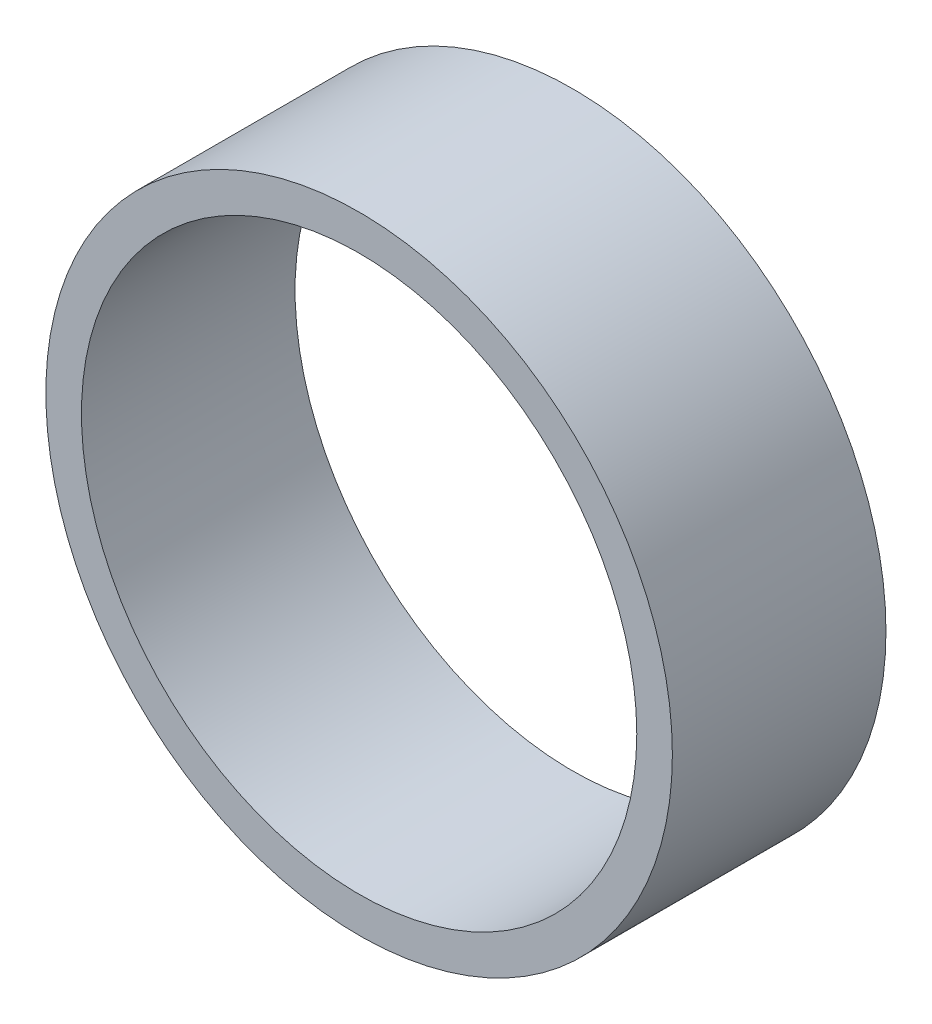
ISO-10303-21;
HEADER;
FILE_DESCRIPTION(('STEP AP214'),'2;1');
FILE_NAME('part.step','',(''),(''),'','','');
FILE_SCHEMA(('AUTOMOTIVE_DESIGN { 1 0 10303 214 1 1 1 1 }'));
ENDSEC;
DATA;
#1=APPLICATION_CONTEXT('core data for automotive mechanical design processes');
#2=APPLICATION_PROTOCOL_DEFINITION('international standard','automotive_design',2000,#1);
#3=PRODUCT_CONTEXT('',#1,'mechanical');
#4=PRODUCT('Part','Part','',(#3));
#5=PRODUCT_RELATED_PRODUCT_CATEGORY('part','',(#4));
#6=PRODUCT_DEFINITION_FORMATION('','',#4);
#7=PRODUCT_DEFINITION_CONTEXT('part definition',#1,'design');
#8=PRODUCT_DEFINITION('design','',#6,#7);
#9=PRODUCT_DEFINITION_SHAPE('','',#8);
#10=(LENGTH_UNIT() NAMED_UNIT(*) SI_UNIT(.MILLI.,.METRE.));
#11=(NAMED_UNIT(*) PLANE_ANGLE_UNIT() SI_UNIT($,.RADIAN.));
#12=(NAMED_UNIT(*) SI_UNIT($,.STERADIAN.) SOLID_ANGLE_UNIT());
#13=UNCERTAINTY_MEASURE_WITH_UNIT(LENGTH_MEASURE(1.E-05),#10,'distance_accuracy_value','');
#14=(GEOMETRIC_REPRESENTATION_CONTEXT(3) GLOBAL_UNCERTAINTY_ASSIGNED_CONTEXT((#13)) GLOBAL_UNIT_ASSIGNED_CONTEXT((#10,
#11,#12)) REPRESENTATION_CONTEXT('',''));
#15=CARTESIAN_POINT('',(0.,0.,0.));
#16=DIRECTION('',(0.,0.,1.));
#17=DIRECTION('',(1.,0.,0.));
#18=AXIS2_PLACEMENT_3D('',#15,#16,#17);
#19=CARTESIAN_POINT('',(0.,0.,30.));
#20=DIRECTION('',(0.,0.,1.));
#21=DIRECTION('',(1.,0.,0.));
#22=AXIS2_PLACEMENT_3D('',#19,#20,#21);
#23=PLANE('',#22);
#24=CARTESIAN_POINT('',(0.,0.,30.));
#25=DIRECTION('',(0.,0.,1.));
#26=DIRECTION('',(1.,0.,0.));
#27=AXIS2_PLACEMENT_3D('',#24,#25,#26);
#28=CIRCLE('',#27,44.);
#29=CARTESIAN_POINT('',(44.,0.,30.));
#30=VERTEX_POINT('',#29);
#31=EDGE_CURVE('E10',#30,#30,#28,.T.);
#32=ORIENTED_EDGE('',*,*,#31,.T.);
#33=EDGE_LOOP('',(#32));
#34=FACE_BOUND('',#33,.T.);
#35=CARTESIAN_POINT('',(0.,0.,30.));
#36=DIRECTION('',(0.,0.,1.));
#37=DIRECTION('',(1.,0.,0.));
#38=AXIS2_PLACEMENT_3D('',#35,#36,#37);
#39=CIRCLE('',#38,39.);
#40=CARTESIAN_POINT('',(39.,0.,30.));
#41=VERTEX_POINT('',#40);
#42=EDGE_CURVE('E42',#41,#41,#39,.T.);
#43=ORIENTED_EDGE('',*,*,#42,.F.);
#44=EDGE_LOOP('',(#43));
#45=FACE_BOUND('',#44,.T.);
#46=ADVANCED_FACE('F31',(#34,#45),#23,.T.);
#47=CARTESIAN_POINT('',(0.,0.,0.));
#48=DIRECTION('',(0.,0.,1.));
#49=DIRECTION('',(1.,0.,0.));
#50=AXIS2_PLACEMENT_3D('',#47,#48,#49);
#51=PLANE('',#50);
#52=CARTESIAN_POINT('',(0.,0.,0.));
#53=DIRECTION('',(0.,0.,1.));
#54=DIRECTION('',(1.,0.,0.));
#55=AXIS2_PLACEMENT_3D('',#52,#53,#54);
#56=CIRCLE('',#55,44.);
#57=CARTESIAN_POINT('',(44.,0.,0.));
#58=VERTEX_POINT('',#57);
#59=EDGE_CURVE('E35',#58,#58,#56,.T.);
#60=ORIENTED_EDGE('',*,*,#59,.F.);
#61=EDGE_LOOP('',(#60));
#62=FACE_BOUND('',#61,.T.);
#63=CARTESIAN_POINT('',(0.,0.,0.));
#64=DIRECTION('',(0.,0.,1.));
#65=DIRECTION('',(1.,0.,0.));
#66=AXIS2_PLACEMENT_3D('',#63,#64,#65);
#67=CIRCLE('',#66,39.);
#68=CARTESIAN_POINT('',(39.,0.,0.));
#69=VERTEX_POINT('',#68);
#70=EDGE_CURVE('E44',#69,#69,#67,.T.);
#71=ORIENTED_EDGE('',*,*,#70,.T.);
#72=EDGE_LOOP('',(#71));
#73=FACE_BOUND('',#72,.T.);
#74=ADVANCED_FACE('F54',(#62,#73),#51,.F.);
#75=CARTESIAN_POINT('',(0.,0.,30.));
#76=DIRECTION('',(0.,0.,-1.));
#77=DIRECTION('',(-1.,0.,0.));
#78=AXIS2_PLACEMENT_3D('',#75,#76,#77);
#79=CYLINDRICAL_SURFACE('',#78,44.);
#80=ORIENTED_EDGE('',*,*,#31,.F.);
#81=EDGE_LOOP('',(#80));
#82=FACE_BOUND('',#81,.T.);
#83=ORIENTED_EDGE('',*,*,#59,.T.);
#84=EDGE_LOOP('',(#83));
#85=FACE_BOUND('',#84,.T.);
#86=ADVANCED_FACE('F33',(#82,#85),#79,.T.);
#87=CARTESIAN_POINT('',(0.,0.,30.));
#88=DIRECTION('',(0.,0.,-1.));
#89=DIRECTION('',(-1.,0.,0.));
#90=AXIS2_PLACEMENT_3D('',#87,#88,#89);
#91=CYLINDRICAL_SURFACE('',#90,39.);
#92=ORIENTED_EDGE('',*,*,#42,.T.);
#93=EDGE_LOOP('',(#92));
#94=FACE_BOUND('',#93,.T.);
#95=ORIENTED_EDGE('',*,*,#70,.F.);
#96=EDGE_LOOP('',(#95));
#97=FACE_BOUND('',#96,.T.);
#98=ADVANCED_FACE('F50',(#94,#97),#91,.F.);
#99=CLOSED_SHELL('',(#46,#74,#86,#98));
#100=MANIFOLD_SOLID_BREP('B2',#99);
#101=ADVANCED_BREP_SHAPE_REPRESENTATION('',(#18,#100),#14);
#102=SHAPE_DEFINITION_REPRESENTATION(#9,#101);
ENDSEC;
END-ISO-10303-21;
